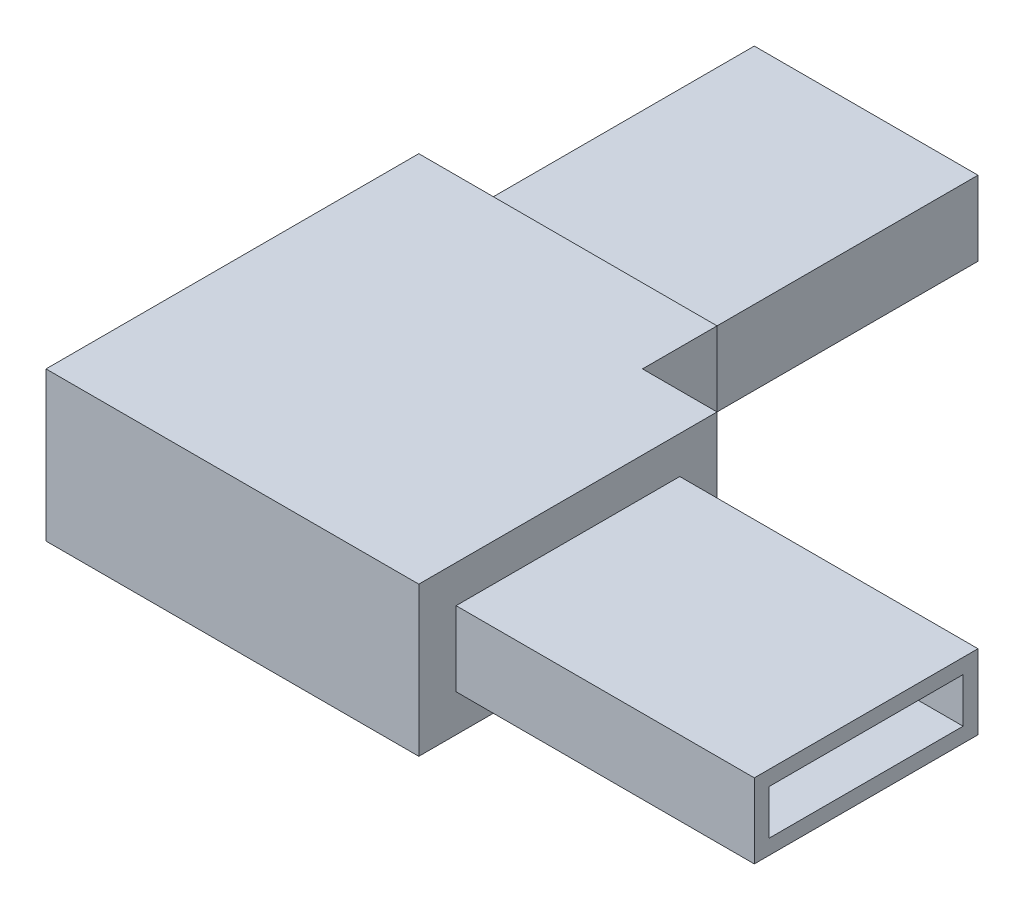
ISO-10303-21;
HEADER;
FILE_DESCRIPTION(('STEP AP214'),'2;1');
FILE_NAME('part.step','',(''),(''),'','','');
FILE_SCHEMA(('AUTOMOTIVE_DESIGN { 1 0 10303 214 1 1 1 1 }'));
ENDSEC;
DATA;
#1=APPLICATION_CONTEXT('core data for automotive mechanical design processes');
#2=APPLICATION_PROTOCOL_DEFINITION('international standard','automotive_design',2000,#1);
#3=PRODUCT_CONTEXT('',#1,'mechanical');
#4=PRODUCT('Part','Part','',(#3));
#5=PRODUCT_RELATED_PRODUCT_CATEGORY('part','',(#4));
#6=PRODUCT_DEFINITION_FORMATION('','',#4);
#7=PRODUCT_DEFINITION_CONTEXT('part definition',#1,'design');
#8=PRODUCT_DEFINITION('design','',#6,#7);
#9=PRODUCT_DEFINITION_SHAPE('','',#8);
#10=(LENGTH_UNIT() NAMED_UNIT(*) SI_UNIT(.MILLI.,.METRE.));
#11=(NAMED_UNIT(*) PLANE_ANGLE_UNIT() SI_UNIT($,.RADIAN.));
#12=(NAMED_UNIT(*) SI_UNIT($,.STERADIAN.) SOLID_ANGLE_UNIT());
#13=UNCERTAINTY_MEASURE_WITH_UNIT(LENGTH_MEASURE(1.E-05),#10,'distance_accuracy_value','');
#14=(GEOMETRIC_REPRESENTATION_CONTEXT(3) GLOBAL_UNCERTAINTY_ASSIGNED_CONTEXT((#13)) GLOBAL_UNIT_ASSIGNED_CONTEXT((#10,
#11,#12)) REPRESENTATION_CONTEXT('',''));
#15=CARTESIAN_POINT('',(0.,0.,0.));
#16=DIRECTION('',(0.,0.,1.));
#17=DIRECTION('',(1.,0.,0.));
#18=AXIS2_PLACEMENT_3D('',#15,#16,#17);
#19=CARTESIAN_POINT('',(70.,20.,-17.9567336544027));
#20=DIRECTION('',(-1.,0.,0.));
#21=DIRECTION('',(0.,0.,1.));
#22=AXIS2_PLACEMENT_3D('',#19,#20,#21);
#23=PLANE('',#22);
#24=DIRECTION('',(0.,-1.,0.));
#25=VECTOR('',#24,1.);
#26=CARTESIAN_POINT('',(70.,15.,15.));
#27=LINE('',#26,#25);
#28=CARTESIAN_POINT('',(70.,15.,15.));
#29=VERTEX_POINT('',#28);
#30=CARTESIAN_POINT('',(70.,5.,15.));
#31=VERTEX_POINT('',#30);
#32=EDGE_CURVE('E378',#29,#31,#27,.T.);
#33=ORIENTED_EDGE('',*,*,#32,.T.);
#34=DIRECTION('',(0.,0.,-1.));
#35=VECTOR('',#34,1.);
#36=CARTESIAN_POINT('',(70.,5.,15.));
#37=LINE('',#36,#35);
#38=CARTESIAN_POINT('',(70.,5.,-15.));
#39=VERTEX_POINT('',#38);
#40=EDGE_CURVE('E395',#31,#39,#37,.T.);
#41=ORIENTED_EDGE('',*,*,#40,.T.);
#42=DIRECTION('',(0.,1.,0.));
#43=VECTOR('',#42,1.);
#44=CARTESIAN_POINT('',(70.,5.,-15.));
#45=LINE('',#44,#43);
#46=CARTESIAN_POINT('',(70.,15.,-15.));
#47=VERTEX_POINT('',#46);
#48=EDGE_CURVE('E398',#39,#47,#45,.T.);
#49=ORIENTED_EDGE('',*,*,#48,.T.);
#50=DIRECTION('',(0.,0.,1.));
#51=VECTOR('',#50,1.);
#52=CARTESIAN_POINT('',(70.,15.,-15.));
#53=LINE('',#52,#51);
#54=EDGE_CURVE('E383',#47,#29,#53,.T.);
#55=ORIENTED_EDGE('',*,*,#54,.T.);
#56=EDGE_LOOP('',(#33,#41,#49,#55));
#57=FACE_BOUND('',#56,.T.);
#58=DIRECTION('',(0.,-1.,0.));
#59=VECTOR('',#58,1.);
#60=CARTESIAN_POINT('',(70.,15.,13.));
#61=LINE('',#60,#59);
#62=CARTESIAN_POINT('',(70.,13.,13.));
#63=VERTEX_POINT('',#62);
#64=CARTESIAN_POINT('',(70.,7.,13.));
#65=VERTEX_POINT('',#64);
#66=EDGE_CURVE('E232',#63,#65,#61,.T.);
#67=ORIENTED_EDGE('',*,*,#66,.F.);
#68=DIRECTION('',(0.,0.,1.));
#69=VECTOR('',#68,1.);
#70=CARTESIAN_POINT('',(70.,13.,-15.));
#71=LINE('',#70,#69);
#72=CARTESIAN_POINT('',(70.,13.,-13.));
#73=VERTEX_POINT('',#72);
#74=EDGE_CURVE('E292',#73,#63,#71,.T.);
#75=ORIENTED_EDGE('',*,*,#74,.F.);
#76=DIRECTION('',(0.,1.,0.));
#77=VECTOR('',#76,1.);
#78=CARTESIAN_POINT('',(70.,5.,-13.));
#79=LINE('',#78,#77);
#80=CARTESIAN_POINT('',(70.,7.,-13.));
#81=VERTEX_POINT('',#80);
#82=EDGE_CURVE('E49',#81,#73,#79,.T.);
#83=ORIENTED_EDGE('',*,*,#82,.F.);
#84=DIRECTION('',(0.,0.,-1.));
#85=VECTOR('',#84,1.);
#86=CARTESIAN_POINT('',(70.,7.,15.));
#87=LINE('',#86,#85);
#88=EDGE_CURVE('E323',#65,#81,#87,.T.);
#89=ORIENTED_EDGE('',*,*,#88,.F.);
#90=EDGE_LOOP('',(#67,#75,#83,#89));
#91=FACE_BOUND('',#90,.T.);
#92=ADVANCED_FACE('F33',(#57,#91),#23,.F.);
#93=CARTESIAN_POINT('',(-103.501393306404,20.,-17.9567336544027));
#94=DIRECTION('',(0.,1.,0.));
#95=DIRECTION('',(0.,0.,1.));
#96=AXIS2_PLACEMENT_3D('',#93,#94,#95);
#97=PLANE('',#96);
#98=DIRECTION('',(0.,0.,-1.));
#99=VECTOR('',#98,1.);
#100=CARTESIAN_POINT('',(20.,20.,-17.9567336544027));
#101=LINE('',#100,#99);
#102=CARTESIAN_POINT('',(20.,20.,-20.));
#103=VERTEX_POINT('',#102);
#104=CARTESIAN_POINT('',(20.,20.,-30.));
#105=VERTEX_POINT('',#104);
#106=EDGE_CURVE('E429',#103,#105,#101,.T.);
#107=ORIENTED_EDGE('',*,*,#106,.T.);
#108=DIRECTION('',(1.,0.,0.));
#109=VECTOR('',#108,1.);
#110=CARTESIAN_POINT('',(-20.,20.,-30.));
#111=LINE('',#110,#109);
#112=CARTESIAN_POINT('',(-20.,20.,-30.));
#113=VERTEX_POINT('',#112);
#114=EDGE_CURVE('E376',#113,#105,#111,.T.);
#115=ORIENTED_EDGE('',*,*,#114,.F.);
#116=DIRECTION('',(0.,0.,-1.));
#117=VECTOR('',#116,1.);
#118=CARTESIAN_POINT('',(-20.,20.,-17.9567336544027));
#119=LINE('',#118,#117);
#120=CARTESIAN_POINT('',(-20.,20.,20.));
#121=VERTEX_POINT('',#120);
#122=EDGE_CURVE('E420',#121,#113,#119,.T.);
#123=ORIENTED_EDGE('',*,*,#122,.F.);
#124=DIRECTION('',(-1.,0.,0.));
#125=VECTOR('',#124,1.);
#126=CARTESIAN_POINT('',(-103.501393306404,20.,20.));
#127=LINE('',#126,#125);
#128=CARTESIAN_POINT('',(30.,20.,20.));
#129=VERTEX_POINT('',#128);
#130=EDGE_CURVE('E423',#129,#121,#127,.T.);
#131=ORIENTED_EDGE('',*,*,#130,.F.);
#132=DIRECTION('',(0.,0.,1.));
#133=VECTOR('',#132,1.);
#134=CARTESIAN_POINT('',(30.,20.,-20.));
#135=LINE('',#134,#133);
#136=CARTESIAN_POINT('',(30.,20.,-20.));
#137=VERTEX_POINT('',#136);
#138=EDGE_CURVE('E417',#137,#129,#135,.T.);
#139=ORIENTED_EDGE('',*,*,#138,.F.);
#140=DIRECTION('',(1.,0.,0.));
#141=VECTOR('',#140,1.);
#142=CARTESIAN_POINT('',(-103.501393306404,20.,-20.));
#143=LINE('',#142,#141);
#144=EDGE_CURVE('E426',#103,#137,#143,.T.);
#145=ORIENTED_EDGE('',*,*,#144,.F.);
#146=EDGE_LOOP('',(#107,#115,#123,#131,#139,#145));
#147=FACE_BOUND('',#146,.T.);
#148=ADVANCED_FACE('F461',(#147),#97,.T.);
#149=CARTESIAN_POINT('',(-103.501393306404,0.,-17.9567336544027));
#150=DIRECTION('',(0.,1.,0.));
#151=DIRECTION('',(0.,0.,1.));
#152=AXIS2_PLACEMENT_3D('',#149,#150,#151);
#153=PLANE('',#152);
#154=DIRECTION('',(-1.,0.,0.));
#155=VECTOR('',#154,1.);
#156=CARTESIAN_POINT('',(20.,0.,-30.));
#157=LINE('',#156,#155);
#158=CARTESIAN_POINT('',(20.,0.,-30.));
#159=VERTEX_POINT('',#158);
#160=CARTESIAN_POINT('',(-20.,0.,-30.));
#161=VERTEX_POINT('',#160);
#162=EDGE_CURVE('E372',#159,#161,#157,.T.);
#163=ORIENTED_EDGE('',*,*,#162,.F.);
#164=DIRECTION('',(0.,0.,-1.));
#165=VECTOR('',#164,1.);
#166=CARTESIAN_POINT('',(20.,0.,-17.9567336544027));
#167=LINE('',#166,#165);
#168=CARTESIAN_POINT('',(20.,0.,-20.));
#169=VERTEX_POINT('',#168);
#170=EDGE_CURVE('E424',#169,#159,#167,.T.);
#171=ORIENTED_EDGE('',*,*,#170,.F.);
#172=DIRECTION('',(1.,0.,0.));
#173=VECTOR('',#172,1.);
#174=CARTESIAN_POINT('',(-103.501393306404,0.,-20.));
#175=LINE('',#174,#173);
#176=CARTESIAN_POINT('',(30.,0.,-20.));
#177=VERTEX_POINT('',#176);
#178=EDGE_CURVE('E436',#169,#177,#175,.T.);
#179=ORIENTED_EDGE('',*,*,#178,.T.);
#180=DIRECTION('',(0.,0.,-1.));
#181=VECTOR('',#180,1.);
#182=CARTESIAN_POINT('',(30.,0.,20.));
#183=LINE('',#182,#181);
#184=CARTESIAN_POINT('',(30.,0.,20.));
#185=VERTEX_POINT('',#184);
#186=EDGE_CURVE('E413',#185,#177,#183,.T.);
#187=ORIENTED_EDGE('',*,*,#186,.F.);
#188=DIRECTION('',(-1.,0.,0.));
#189=VECTOR('',#188,1.);
#190=CARTESIAN_POINT('',(-103.501393306404,0.,20.));
#191=LINE('',#190,#189);
#192=CARTESIAN_POINT('',(-20.,0.,20.));
#193=VERTEX_POINT('',#192);
#194=EDGE_CURVE('E434',#185,#193,#191,.T.);
#195=ORIENTED_EDGE('',*,*,#194,.T.);
#196=DIRECTION('',(0.,0.,-1.));
#197=VECTOR('',#196,1.);
#198=CARTESIAN_POINT('',(-20.,0.,-17.9567336544027));
#199=LINE('',#198,#197);
#200=EDGE_CURVE('E419',#193,#161,#199,.T.);
#201=ORIENTED_EDGE('',*,*,#200,.T.);
#202=EDGE_LOOP('',(#163,#171,#179,#187,#195,#201));
#203=FACE_BOUND('',#202,.T.);
#204=ADVANCED_FACE('F451',(#203),#153,.F.);
#205=CARTESIAN_POINT('',(-20.,20.,-17.9567336544027));
#206=DIRECTION('',(-1.,0.,0.));
#207=DIRECTION('',(0.,0.,1.));
#208=AXIS2_PLACEMENT_3D('',#205,#206,#207);
#209=PLANE('',#208);
#210=CARTESIAN_POINT('',(-20.,10.,-5.));
#211=DIRECTION('',(-1.,0.,0.));
#212=DIRECTION('',(0.,0.,1.));
#213=AXIS2_PLACEMENT_3D('',#210,#211,#212);
#214=CIRCLE('',#213,5.00000000000001);
#215=CARTESIAN_POINT('',(-20.,10.,0.));
#216=VERTEX_POINT('',#215);
#217=EDGE_CURVE('E253',#216,#216,#214,.T.);
#218=ORIENTED_EDGE('',*,*,#217,.F.);
#219=EDGE_LOOP('',(#218));
#220=FACE_BOUND('',#219,.T.);
#221=ORIENTED_EDGE('',*,*,#122,.T.);
#222=DIRECTION('',(0.,1.,0.));
#223=VECTOR('',#222,1.);
#224=CARTESIAN_POINT('',(-20.,0.,-30.));
#225=LINE('',#224,#223);
#226=EDGE_CURVE('E374',#161,#113,#225,.T.);
#227=ORIENTED_EDGE('',*,*,#226,.F.);
#228=ORIENTED_EDGE('',*,*,#200,.F.);
#229=DIRECTION('',(0.,-1.,0.));
#230=VECTOR('',#229,1.);
#231=CARTESIAN_POINT('',(-20.,20.,20.));
#232=LINE('',#231,#230);
#233=EDGE_CURVE('E11',#121,#193,#232,.T.);
#234=ORIENTED_EDGE('',*,*,#233,.F.);
#235=EDGE_LOOP('',(#221,#227,#228,#234));
#236=FACE_BOUND('',#235,.T.);
#237=ADVANCED_FACE('F35',(#220,#236),#209,.T.);
#238=CARTESIAN_POINT('',(20.,20.,-17.9567336544027));
#239=DIRECTION('',(-1.,0.,0.));
#240=DIRECTION('',(0.,0.,1.));
#241=AXIS2_PLACEMENT_3D('',#238,#239,#240);
#242=PLANE('',#241);
#243=DIRECTION('',(0.,-1.,0.));
#244=VECTOR('',#243,1.);
#245=CARTESIAN_POINT('',(20.,20.,-30.));
#246=LINE('',#245,#244);
#247=EDGE_CURVE('E364',#105,#159,#246,.T.);
#248=ORIENTED_EDGE('',*,*,#247,.F.);
#249=ORIENTED_EDGE('',*,*,#106,.F.);
#250=DIRECTION('',(0.,-1.,0.));
#251=VECTOR('',#250,1.);
#252=CARTESIAN_POINT('',(20.,20.,-20.));
#253=LINE('',#252,#251);
#254=EDGE_CURVE('E42',#103,#169,#253,.T.);
#255=ORIENTED_EDGE('',*,*,#254,.T.);
#256=ORIENTED_EDGE('',*,*,#170,.T.);
#257=EDGE_LOOP('',(#248,#249,#255,#256));
#258=FACE_BOUND('',#257,.T.);
#259=ADVANCED_FACE('F445',(#258),#242,.F.);
#260=CARTESIAN_POINT('',(-103.501393306404,20.,20.));
#261=DIRECTION('',(0.,0.,1.));
#262=DIRECTION('',(1.,0.,0.));
#263=AXIS2_PLACEMENT_3D('',#260,#261,#262);
#264=PLANE('',#263);
#265=ORIENTED_EDGE('',*,*,#194,.F.);
#266=DIRECTION('',(0.,-1.,0.));
#267=VECTOR('',#266,1.);
#268=CARTESIAN_POINT('',(30.,20.,20.));
#269=LINE('',#268,#267);
#270=EDGE_CURVE('E405',#129,#185,#269,.T.);
#271=ORIENTED_EDGE('',*,*,#270,.F.);
#272=ORIENTED_EDGE('',*,*,#130,.T.);
#273=ORIENTED_EDGE('',*,*,#233,.T.);
#274=EDGE_LOOP('',(#265,#271,#272,#273));
#275=FACE_BOUND('',#274,.T.);
#276=ADVANCED_FACE('F467',(#275),#264,.T.);
#277=CARTESIAN_POINT('',(-103.501393306404,20.,-20.));
#278=DIRECTION('',(0.,0.,-1.));
#279=DIRECTION('',(-1.,0.,0.));
#280=AXIS2_PLACEMENT_3D('',#277,#278,#279);
#281=PLANE('',#280);
#282=ORIENTED_EDGE('',*,*,#144,.T.);
#283=DIRECTION('',(0.,1.,0.));
#284=VECTOR('',#283,1.);
#285=CARTESIAN_POINT('',(30.,0.,-20.));
#286=LINE('',#285,#284);
#287=EDGE_CURVE('E415',#177,#137,#286,.T.);
#288=ORIENTED_EDGE('',*,*,#287,.F.);
#289=ORIENTED_EDGE('',*,*,#178,.F.);
#290=ORIENTED_EDGE('',*,*,#254,.F.);
#291=EDGE_LOOP('',(#282,#288,#289,#290));
#292=FACE_BOUND('',#291,.T.);
#293=ADVANCED_FACE('F454',(#292),#281,.T.);
#294=CARTESIAN_POINT('',(30.,0.,20.));
#295=DIRECTION('',(1.,0.,0.));
#296=DIRECTION('',(0.,0.,-1.));
#297=AXIS2_PLACEMENT_3D('',#294,#295,#296);
#298=PLANE('',#297);
#299=DIRECTION('',(0.,0.,1.));
#300=VECTOR('',#299,1.);
#301=CARTESIAN_POINT('',(30.,15.,-15.));
#302=LINE('',#301,#300);
#303=CARTESIAN_POINT('',(30.,15.,-15.));
#304=VERTEX_POINT('',#303);
#305=CARTESIAN_POINT('',(30.,15.,15.));
#306=VERTEX_POINT('',#305);
#307=EDGE_CURVE('E389',#304,#306,#302,.T.);
#308=ORIENTED_EDGE('',*,*,#307,.F.);
#309=DIRECTION('',(0.,1.,0.));
#310=VECTOR('',#309,1.);
#311=CARTESIAN_POINT('',(30.,5.,-15.));
#312=LINE('',#311,#310);
#313=CARTESIAN_POINT('',(30.,5.,-15.));
#314=VERTEX_POINT('',#313);
#315=EDGE_CURVE('E386',#314,#304,#312,.T.);
#316=ORIENTED_EDGE('',*,*,#315,.F.);
#317=DIRECTION('',(0.,0.,-1.));
#318=VECTOR('',#317,1.);
#319=CARTESIAN_POINT('',(30.,5.,15.));
#320=LINE('',#319,#318);
#321=CARTESIAN_POINT('',(30.,5.,15.));
#322=VERTEX_POINT('',#321);
#323=EDGE_CURVE('E382',#322,#314,#320,.T.);
#324=ORIENTED_EDGE('',*,*,#323,.F.);
#325=DIRECTION('',(0.,-1.,0.));
#326=VECTOR('',#325,1.);
#327=CARTESIAN_POINT('',(30.,15.,15.));
#328=LINE('',#327,#326);
#329=EDGE_CURVE('E379',#306,#322,#328,.T.);
#330=ORIENTED_EDGE('',*,*,#329,.F.);
#331=EDGE_LOOP('',(#308,#316,#324,#330));
#332=FACE_BOUND('',#331,.T.);
#333=ORIENTED_EDGE('',*,*,#270,.T.);
#334=ORIENTED_EDGE('',*,*,#186,.T.);
#335=ORIENTED_EDGE('',*,*,#287,.T.);
#336=ORIENTED_EDGE('',*,*,#138,.T.);
#337=EDGE_LOOP('',(#333,#334,#335,#336));
#338=FACE_BOUND('',#337,.T.);
#339=ADVANCED_FACE('F457',(#332,#338),#298,.T.);
#340=CARTESIAN_POINT('',(30.,15.,15.));
#341=DIRECTION('',(0.,0.,1.));
#342=DIRECTION('',(1.,0.,0.));
#343=AXIS2_PLACEMENT_3D('',#340,#341,#342);
#344=PLANE('',#343);
#345=ORIENTED_EDGE('',*,*,#32,.F.);
#346=DIRECTION('',(1.,0.,0.));
#347=VECTOR('',#346,1.);
#348=CARTESIAN_POINT('',(30.,15.,15.));
#349=LINE('',#348,#347);
#350=EDGE_CURVE('E403',#306,#29,#349,.T.);
#351=ORIENTED_EDGE('',*,*,#350,.F.);
#352=ORIENTED_EDGE('',*,*,#329,.T.);
#353=DIRECTION('',(1.,0.,0.));
#354=VECTOR('',#353,1.);
#355=CARTESIAN_POINT('',(30.,5.,15.));
#356=LINE('',#355,#354);
#357=EDGE_CURVE('E392',#322,#31,#356,.T.);
#358=ORIENTED_EDGE('',*,*,#357,.T.);
#359=EDGE_LOOP('',(#345,#351,#352,#358));
#360=FACE_BOUND('',#359,.T.);
#361=ADVANCED_FACE('F520',(#360),#344,.T.);
#362=CARTESIAN_POINT('',(30.,15.,-15.));
#363=DIRECTION('',(0.,1.,0.));
#364=DIRECTION('',(0.,0.,1.));
#365=AXIS2_PLACEMENT_3D('',#362,#363,#364);
#366=PLANE('',#365);
#367=ORIENTED_EDGE('',*,*,#54,.F.);
#368=DIRECTION('',(1.,0.,0.));
#369=VECTOR('',#368,1.);
#370=CARTESIAN_POINT('',(30.,15.,-15.));
#371=LINE('',#370,#369);
#372=EDGE_CURVE('E406',#304,#47,#371,.T.);
#373=ORIENTED_EDGE('',*,*,#372,.F.);
#374=ORIENTED_EDGE('',*,*,#307,.T.);
#375=ORIENTED_EDGE('',*,*,#350,.T.);
#376=EDGE_LOOP('',(#367,#373,#374,#375));
#377=FACE_BOUND('',#376,.T.);
#378=ADVANCED_FACE('F523',(#377),#366,.T.);
#379=CARTESIAN_POINT('',(30.,5.,-15.));
#380=DIRECTION('',(0.,0.,-1.));
#381=DIRECTION('',(-1.,0.,0.));
#382=AXIS2_PLACEMENT_3D('',#379,#380,#381);
#383=PLANE('',#382);
#384=ORIENTED_EDGE('',*,*,#48,.F.);
#385=DIRECTION('',(1.,0.,0.));
#386=VECTOR('',#385,1.);
#387=CARTESIAN_POINT('',(30.,5.,-15.));
#388=LINE('',#387,#386);
#389=EDGE_CURVE('E408',#314,#39,#388,.T.);
#390=ORIENTED_EDGE('',*,*,#389,.F.);
#391=ORIENTED_EDGE('',*,*,#315,.T.);
#392=ORIENTED_EDGE('',*,*,#372,.T.);
#393=EDGE_LOOP('',(#384,#390,#391,#392));
#394=FACE_BOUND('',#393,.T.);
#395=ADVANCED_FACE('F485',(#394),#383,.T.);
#396=CARTESIAN_POINT('',(30.,5.,15.));
#397=DIRECTION('',(0.,-1.,0.));
#398=DIRECTION('',(0.,0.,-1.));
#399=AXIS2_PLACEMENT_3D('',#396,#397,#398);
#400=PLANE('',#399);
#401=ORIENTED_EDGE('',*,*,#40,.F.);
#402=ORIENTED_EDGE('',*,*,#357,.F.);
#403=ORIENTED_EDGE('',*,*,#323,.T.);
#404=ORIENTED_EDGE('',*,*,#389,.T.);
#405=EDGE_LOOP('',(#401,#402,#403,#404));
#406=FACE_BOUND('',#405,.T.);
#407=ADVANCED_FACE('F475',(#406),#400,.T.);
#408=CARTESIAN_POINT('',(20.,0.,-30.));
#409=DIRECTION('',(0.,0.,-1.));
#410=DIRECTION('',(-1.,0.,0.));
#411=AXIS2_PLACEMENT_3D('',#408,#409,#410);
#412=PLANE('',#411);
#413=DIRECTION('',(1.,0.,0.));
#414=VECTOR('',#413,1.);
#415=CARTESIAN_POINT('',(-15.,15.,-30.));
#416=LINE('',#415,#414);
#417=CARTESIAN_POINT('',(-15.,15.,-30.));
#418=VERTEX_POINT('',#417);
#419=CARTESIAN_POINT('',(15.,15.,-30.));
#420=VERTEX_POINT('',#419);
#421=EDGE_CURVE('E348',#418,#420,#416,.T.);
#422=ORIENTED_EDGE('',*,*,#421,.F.);
#423=DIRECTION('',(0.,1.,0.));
#424=VECTOR('',#423,1.);
#425=CARTESIAN_POINT('',(-15.,5.,-30.));
#426=LINE('',#425,#424);
#427=CARTESIAN_POINT('',(-15.,5.,-30.));
#428=VERTEX_POINT('',#427);
#429=EDGE_CURVE('E345',#428,#418,#426,.T.);
#430=ORIENTED_EDGE('',*,*,#429,.F.);
#431=DIRECTION('',(-1.,0.,0.));
#432=VECTOR('',#431,1.);
#433=CARTESIAN_POINT('',(15.,5.,-30.));
#434=LINE('',#433,#432);
#435=CARTESIAN_POINT('',(15.,5.,-30.));
#436=VERTEX_POINT('',#435);
#437=EDGE_CURVE('E341',#436,#428,#434,.T.);
#438=ORIENTED_EDGE('',*,*,#437,.F.);
#439=DIRECTION('',(0.,-1.,0.));
#440=VECTOR('',#439,1.);
#441=CARTESIAN_POINT('',(15.,15.,-30.));
#442=LINE('',#441,#440);
#443=EDGE_CURVE('E338',#420,#436,#442,.T.);
#444=ORIENTED_EDGE('',*,*,#443,.F.);
#445=EDGE_LOOP('',(#422,#430,#438,#444));
#446=FACE_BOUND('',#445,.T.);
#447=ORIENTED_EDGE('',*,*,#247,.T.);
#448=ORIENTED_EDGE('',*,*,#162,.T.);
#449=ORIENTED_EDGE('',*,*,#226,.T.);
#450=ORIENTED_EDGE('',*,*,#114,.T.);
#451=EDGE_LOOP('',(#447,#448,#449,#450));
#452=FACE_BOUND('',#451,.T.);
#453=ADVANCED_FACE('F472',(#446,#452),#412,.T.);
#454=CARTESIAN_POINT('',(15.,15.,-30.));
#455=DIRECTION('',(1.,0.,0.));
#456=DIRECTION('',(0.,1.,0.));
#457=AXIS2_PLACEMENT_3D('',#454,#455,#456);
#458=PLANE('',#457);
#459=DIRECTION('',(0.,-1.,0.));
#460=VECTOR('',#459,1.);
#461=CARTESIAN_POINT('',(15.,15.,-70.));
#462=LINE('',#461,#460);
#463=CARTESIAN_POINT('',(15.,15.,-70.));
#464=VERTEX_POINT('',#463);
#465=CARTESIAN_POINT('',(15.,5.,-70.));
#466=VERTEX_POINT('',#465);
#467=EDGE_CURVE('E268',#464,#466,#462,.T.);
#468=ORIENTED_EDGE('',*,*,#467,.F.);
#469=DIRECTION('',(0.,0.,-1.));
#470=VECTOR('',#469,1.);
#471=CARTESIAN_POINT('',(15.,15.,-30.));
#472=LINE('',#471,#470);
#473=EDGE_CURVE('E362',#420,#464,#472,.T.);
#474=ORIENTED_EDGE('',*,*,#473,.F.);
#475=ORIENTED_EDGE('',*,*,#443,.T.);
#476=DIRECTION('',(0.,0.,-1.));
#477=VECTOR('',#476,1.);
#478=CARTESIAN_POINT('',(15.,5.,-30.));
#479=LINE('',#478,#477);
#480=EDGE_CURVE('E351',#436,#466,#479,.T.);
#481=ORIENTED_EDGE('',*,*,#480,.T.);
#482=EDGE_LOOP('',(#468,#474,#475,#481));
#483=FACE_BOUND('',#482,.T.);
#484=ADVANCED_FACE('F474',(#483),#458,.T.);
#485=CARTESIAN_POINT('',(-15.,15.,-30.));
#486=DIRECTION('',(0.,1.,0.));
#487=DIRECTION('',(-1.,0.,0.));
#488=AXIS2_PLACEMENT_3D('',#485,#486,#487);
#489=PLANE('',#488);
#490=DIRECTION('',(1.,0.,0.));
#491=VECTOR('',#490,1.);
#492=CARTESIAN_POINT('',(-15.,15.,-70.));
#493=LINE('',#492,#491);
#494=CARTESIAN_POINT('',(-15.,15.,-70.));
#495=VERTEX_POINT('',#494);
#496=EDGE_CURVE('E342',#495,#464,#493,.T.);
#497=ORIENTED_EDGE('',*,*,#496,.F.);
#498=DIRECTION('',(0.,0.,-1.));
#499=VECTOR('',#498,1.);
#500=CARTESIAN_POINT('',(-15.,15.,-30.));
#501=LINE('',#500,#499);
#502=EDGE_CURVE('E365',#418,#495,#501,.T.);
#503=ORIENTED_EDGE('',*,*,#502,.F.);
#504=ORIENTED_EDGE('',*,*,#421,.T.);
#505=ORIENTED_EDGE('',*,*,#473,.T.);
#506=EDGE_LOOP('',(#497,#503,#504,#505));
#507=FACE_BOUND('',#506,.T.);
#508=ADVANCED_FACE('F482',(#507),#489,.T.);
#509=CARTESIAN_POINT('',(-15.,5.,-30.));
#510=DIRECTION('',(-1.,0.,0.));
#511=DIRECTION('',(0.,0.,1.));
#512=AXIS2_PLACEMENT_3D('',#509,#510,#511);
#513=PLANE('',#512);
#514=DIRECTION('',(0.,1.,0.));
#515=VECTOR('',#514,1.);
#516=CARTESIAN_POINT('',(-15.,5.,-70.));
#517=LINE('',#516,#515);
#518=CARTESIAN_POINT('',(-15.,5.,-70.));
#519=VERTEX_POINT('',#518);
#520=EDGE_CURVE('E357',#519,#495,#517,.T.);
#521=ORIENTED_EDGE('',*,*,#520,.F.);
#522=DIRECTION('',(0.,0.,-1.));
#523=VECTOR('',#522,1.);
#524=CARTESIAN_POINT('',(-15.,5.,-30.));
#525=LINE('',#524,#523);
#526=EDGE_CURVE('E367',#428,#519,#525,.T.);
#527=ORIENTED_EDGE('',*,*,#526,.F.);
#528=ORIENTED_EDGE('',*,*,#429,.T.);
#529=ORIENTED_EDGE('',*,*,#502,.T.);
#530=EDGE_LOOP('',(#521,#527,#528,#529));
#531=FACE_BOUND('',#530,.T.);
#532=ADVANCED_FACE('F589',(#531),#513,.T.);
#533=CARTESIAN_POINT('',(15.,5.,-30.));
#534=DIRECTION('',(0.,-1.,0.));
#535=DIRECTION('',(0.,0.,-1.));
#536=AXIS2_PLACEMENT_3D('',#533,#534,#535);
#537=PLANE('',#536);
#538=DIRECTION('',(-1.,0.,0.));
#539=VECTOR('',#538,1.);
#540=CARTESIAN_POINT('',(15.,5.,-70.));
#541=LINE('',#540,#539);
#542=EDGE_CURVE('E354',#466,#519,#541,.T.);
#543=ORIENTED_EDGE('',*,*,#542,.F.);
#544=ORIENTED_EDGE('',*,*,#480,.F.);
#545=ORIENTED_EDGE('',*,*,#437,.T.);
#546=ORIENTED_EDGE('',*,*,#526,.T.);
#547=EDGE_LOOP('',(#543,#544,#545,#546));
#548=FACE_BOUND('',#547,.T.);
#549=ADVANCED_FACE('F514',(#548),#537,.T.);
#550=CARTESIAN_POINT('',(-103.501393306404,20.,-70.));
#551=DIRECTION('',(0.,0.,-1.));
#552=DIRECTION('',(-1.,0.,0.));
#553=AXIS2_PLACEMENT_3D('',#550,#551,#552);
#554=PLANE('',#553);
#555=DIRECTION('',(1.,0.,0.));
#556=VECTOR('',#555,1.);
#557=CARTESIAN_POINT('',(-103.501393306404,13.,-70.));
#558=LINE('',#557,#556);
#559=CARTESIAN_POINT('',(-13.,13.,-70.));
#560=VERTEX_POINT('',#559);
#561=CARTESIAN_POINT('',(13.,13.,-70.));
#562=VERTEX_POINT('',#561);
#563=EDGE_CURVE('E314',#560,#562,#558,.T.);
#564=ORIENTED_EDGE('',*,*,#563,.F.);
#565=DIRECTION('',(0.,1.,0.));
#566=VECTOR('',#565,1.);
#567=CARTESIAN_POINT('',(-13.,20.,-70.));
#568=LINE('',#567,#566);
#569=CARTESIAN_POINT('',(-13.,7.,-70.));
#570=VERTEX_POINT('',#569);
#571=EDGE_CURVE('E333',#570,#560,#568,.T.);
#572=ORIENTED_EDGE('',*,*,#571,.F.);
#573=DIRECTION('',(-1.,0.,0.));
#574=VECTOR('',#573,1.);
#575=CARTESIAN_POINT('',(-103.501393306404,7.,-70.));
#576=LINE('',#575,#574);
#577=CARTESIAN_POINT('',(13.,7.,-70.));
#578=VERTEX_POINT('',#577);
#579=EDGE_CURVE('E57',#578,#570,#576,.T.);
#580=ORIENTED_EDGE('',*,*,#579,.F.);
#581=DIRECTION('',(0.,-1.,0.));
#582=VECTOR('',#581,1.);
#583=CARTESIAN_POINT('',(13.,20.,-70.));
#584=LINE('',#583,#582);
#585=EDGE_CURVE('E329',#562,#578,#584,.T.);
#586=ORIENTED_EDGE('',*,*,#585,.F.);
#587=EDGE_LOOP('',(#564,#572,#580,#586));
#588=FACE_BOUND('',#587,.T.);
#589=ORIENTED_EDGE('',*,*,#496,.T.);
#590=ORIENTED_EDGE('',*,*,#467,.T.);
#591=ORIENTED_EDGE('',*,*,#542,.T.);
#592=ORIENTED_EDGE('',*,*,#520,.T.);
#593=EDGE_LOOP('',(#589,#590,#591,#592));
#594=FACE_BOUND('',#593,.T.);
#595=ADVANCED_FACE('F511',(#588,#594),#554,.T.);
#596=CARTESIAN_POINT('',(-103.501393306404,18.,-17.9567336544027));
#597=DIRECTION('',(0.,1.,0.));
#598=DIRECTION('',(0.,0.,1.));
#599=AXIS2_PLACEMENT_3D('',#596,#597,#598);
#600=PLANE('',#599);
#601=DIRECTION('',(0.,0.,-1.));
#602=VECTOR('',#601,1.);
#603=CARTESIAN_POINT('',(18.,18.,-17.9567336544027));
#604=LINE('',#603,#602);
#605=CARTESIAN_POINT('',(18.,18.,-18.));
#606=VERTEX_POINT('',#605);
#607=CARTESIAN_POINT('',(18.,18.,-28.));
#608=VERTEX_POINT('',#607);
#609=EDGE_CURVE('E226',#606,#608,#604,.T.);
#610=ORIENTED_EDGE('',*,*,#609,.F.);
#611=DIRECTION('',(1.,0.,0.));
#612=VECTOR('',#611,1.);
#613=CARTESIAN_POINT('',(-103.501393306404,18.,-18.));
#614=LINE('',#613,#612);
#615=CARTESIAN_POINT('',(28.,18.,-18.));
#616=VERTEX_POINT('',#615);
#617=EDGE_CURVE('E246',#606,#616,#614,.T.);
#618=ORIENTED_EDGE('',*,*,#617,.T.);
#619=DIRECTION('',(0.,0.,1.));
#620=VECTOR('',#619,1.);
#621=CARTESIAN_POINT('',(28.,18.,20.));
#622=LINE('',#621,#620);
#623=CARTESIAN_POINT('',(28.,18.,18.));
#624=VERTEX_POINT('',#623);
#625=EDGE_CURVE('E258',#616,#624,#622,.T.);
#626=ORIENTED_EDGE('',*,*,#625,.T.);
#627=DIRECTION('',(-1.,0.,0.));
#628=VECTOR('',#627,1.);
#629=CARTESIAN_POINT('',(-103.501393306404,18.,18.));
#630=LINE('',#629,#628);
#631=CARTESIAN_POINT('',(-18.,18.,18.));
#632=VERTEX_POINT('',#631);
#633=EDGE_CURVE('E250',#624,#632,#630,.T.);
#634=ORIENTED_EDGE('',*,*,#633,.T.);
#635=DIRECTION('',(0.,0.,-1.));
#636=VECTOR('',#635,1.);
#637=CARTESIAN_POINT('',(-18.,18.,-17.9567336544027));
#638=LINE('',#637,#636);
#639=CARTESIAN_POINT('',(-18.,18.,-28.));
#640=VERTEX_POINT('',#639);
#641=EDGE_CURVE('E229',#632,#640,#638,.T.);
#642=ORIENTED_EDGE('',*,*,#641,.T.);
#643=DIRECTION('',(1.,0.,0.));
#644=VECTOR('',#643,1.);
#645=CARTESIAN_POINT('',(20.,18.,-28.));
#646=LINE('',#645,#644);
#647=EDGE_CURVE('E221',#640,#608,#646,.T.);
#648=ORIENTED_EDGE('',*,*,#647,.T.);
#649=EDGE_LOOP('',(#610,#618,#626,#634,#642,#648));
#650=FACE_BOUND('',#649,.T.);
#651=ADVANCED_FACE('F223',(#650),#600,.F.);
#652=CARTESIAN_POINT('',(-103.501393306404,2.,-17.9567336544027));
#653=DIRECTION('',(0.,1.,0.));
#654=DIRECTION('',(0.,0.,1.));
#655=AXIS2_PLACEMENT_3D('',#652,#653,#654);
#656=PLANE('',#655);
#657=DIRECTION('',(-1.,0.,0.));
#658=VECTOR('',#657,1.);
#659=CARTESIAN_POINT('',(-103.501393306404,2.,-28.));
#660=LINE('',#659,#658);
#661=CARTESIAN_POINT('',(18.,2.,-28.));
#662=VERTEX_POINT('',#661);
#663=CARTESIAN_POINT('',(-18.,2.,-28.));
#664=VERTEX_POINT('',#663);
#665=EDGE_CURVE('E238',#662,#664,#660,.T.);
#666=ORIENTED_EDGE('',*,*,#665,.T.);
#667=DIRECTION('',(0.,0.,-1.));
#668=VECTOR('',#667,1.);
#669=CARTESIAN_POINT('',(-18.,2.,-17.9567336544027));
#670=LINE('',#669,#668);
#671=CARTESIAN_POINT('',(-18.,2.,18.));
#672=VERTEX_POINT('',#671);
#673=EDGE_CURVE('E259',#672,#664,#670,.T.);
#674=ORIENTED_EDGE('',*,*,#673,.F.);
#675=DIRECTION('',(-1.,0.,0.));
#676=VECTOR('',#675,1.);
#677=CARTESIAN_POINT('',(-103.501393306404,2.,18.));
#678=LINE('',#677,#676);
#679=CARTESIAN_POINT('',(28.,2.,18.));
#680=VERTEX_POINT('',#679);
#681=EDGE_CURVE('E265',#680,#672,#678,.T.);
#682=ORIENTED_EDGE('',*,*,#681,.F.);
#683=DIRECTION('',(0.,0.,-1.));
#684=VECTOR('',#683,1.);
#685=CARTESIAN_POINT('',(28.,2.,-17.9567336544027));
#686=LINE('',#685,#684);
#687=CARTESIAN_POINT('',(28.,2.,-18.));
#688=VERTEX_POINT('',#687);
#689=EDGE_CURVE('E274',#680,#688,#686,.T.);
#690=ORIENTED_EDGE('',*,*,#689,.T.);
#691=DIRECTION('',(1.,0.,0.));
#692=VECTOR('',#691,1.);
#693=CARTESIAN_POINT('',(-103.501393306404,2.,-18.));
#694=LINE('',#693,#692);
#695=CARTESIAN_POINT('',(18.,2.,-18.));
#696=VERTEX_POINT('',#695);
#697=EDGE_CURVE('E271',#696,#688,#694,.T.);
#698=ORIENTED_EDGE('',*,*,#697,.F.);
#699=DIRECTION('',(0.,0.,-1.));
#700=VECTOR('',#699,1.);
#701=CARTESIAN_POINT('',(18.,2.,-17.9567336544027));
#702=LINE('',#701,#700);
#703=EDGE_CURVE('E256',#696,#662,#702,.T.);
#704=ORIENTED_EDGE('',*,*,#703,.T.);
#705=EDGE_LOOP('',(#666,#674,#682,#690,#698,#704));
#706=FACE_BOUND('',#705,.T.);
#707=ADVANCED_FACE('F627',(#706),#656,.T.);
#708=CARTESIAN_POINT('',(-18.,20.,-17.9567336544027));
#709=DIRECTION('',(-1.,0.,0.));
#710=DIRECTION('',(0.,0.,1.));
#711=AXIS2_PLACEMENT_3D('',#708,#709,#710);
#712=PLANE('',#711);
#713=CARTESIAN_POINT('',(-18.,10.,-5.));
#714=DIRECTION('',(-1.,0.,0.));
#715=DIRECTION('',(0.,0.,1.));
#716=AXIS2_PLACEMENT_3D('',#713,#714,#715);
#717=CIRCLE('',#716,5.00000000000001);
#718=CARTESIAN_POINT('',(-18.,10.,0.));
#719=VERTEX_POINT('',#718);
#720=EDGE_CURVE('E37',#719,#719,#717,.T.);
#721=ORIENTED_EDGE('',*,*,#720,.T.);
#722=EDGE_LOOP('',(#721));
#723=FACE_BOUND('',#722,.T.);
#724=ORIENTED_EDGE('',*,*,#641,.F.);
#725=DIRECTION('',(0.,-1.,0.));
#726=VECTOR('',#725,1.);
#727=CARTESIAN_POINT('',(-18.,20.,18.));
#728=LINE('',#727,#726);
#729=EDGE_CURVE('E248',#632,#672,#728,.T.);
#730=ORIENTED_EDGE('',*,*,#729,.T.);
#731=ORIENTED_EDGE('',*,*,#673,.T.);
#732=DIRECTION('',(0.,1.,0.));
#733=VECTOR('',#732,1.);
#734=CARTESIAN_POINT('',(-18.,0.,-28.));
#735=LINE('',#734,#733);
#736=EDGE_CURVE('E233',#664,#640,#735,.T.);
#737=ORIENTED_EDGE('',*,*,#736,.T.);
#738=EDGE_LOOP('',(#724,#730,#731,#737));
#739=FACE_BOUND('',#738,.T.);
#740=ADVANCED_FACE('F638',(#723,#739),#712,.F.);
#741=CARTESIAN_POINT('',(18.,20.,-17.9567336544027));
#742=DIRECTION('',(-1.,0.,0.));
#743=DIRECTION('',(0.,0.,1.));
#744=AXIS2_PLACEMENT_3D('',#741,#742,#743);
#745=PLANE('',#744);
#746=DIRECTION('',(0.,-1.,0.));
#747=VECTOR('',#746,1.);
#748=CARTESIAN_POINT('',(18.,20.,-28.));
#749=LINE('',#748,#747);
#750=EDGE_CURVE('E236',#608,#662,#749,.T.);
#751=ORIENTED_EDGE('',*,*,#750,.T.);
#752=ORIENTED_EDGE('',*,*,#703,.F.);
#753=DIRECTION('',(0.,-1.,0.));
#754=VECTOR('',#753,1.);
#755=CARTESIAN_POINT('',(18.,20.,-18.));
#756=LINE('',#755,#754);
#757=EDGE_CURVE('E245',#606,#696,#756,.T.);
#758=ORIENTED_EDGE('',*,*,#757,.F.);
#759=ORIENTED_EDGE('',*,*,#609,.T.);
#760=EDGE_LOOP('',(#751,#752,#758,#759));
#761=FACE_BOUND('',#760,.T.);
#762=ADVANCED_FACE('F244',(#761),#745,.T.);
#763=CARTESIAN_POINT('',(-103.501393306404,20.,18.));
#764=DIRECTION('',(0.,0.,1.));
#765=DIRECTION('',(1.,0.,0.));
#766=AXIS2_PLACEMENT_3D('',#763,#764,#765);
#767=PLANE('',#766);
#768=ORIENTED_EDGE('',*,*,#681,.T.);
#769=ORIENTED_EDGE('',*,*,#729,.F.);
#770=ORIENTED_EDGE('',*,*,#633,.F.);
#771=DIRECTION('',(0.,-1.,0.));
#772=VECTOR('',#771,1.);
#773=CARTESIAN_POINT('',(28.,0.,18.));
#774=LINE('',#773,#772);
#775=EDGE_CURVE('E276',#624,#680,#774,.T.);
#776=ORIENTED_EDGE('',*,*,#775,.T.);
#777=EDGE_LOOP('',(#768,#769,#770,#776));
#778=FACE_BOUND('',#777,.T.);
#779=ADVANCED_FACE('F651',(#778),#767,.F.);
#780=CARTESIAN_POINT('',(-103.501393306404,20.,-18.));
#781=DIRECTION('',(0.,0.,-1.));
#782=DIRECTION('',(-1.,0.,0.));
#783=AXIS2_PLACEMENT_3D('',#780,#781,#782);
#784=PLANE('',#783);
#785=ORIENTED_EDGE('',*,*,#617,.F.);
#786=ORIENTED_EDGE('',*,*,#757,.T.);
#787=ORIENTED_EDGE('',*,*,#697,.T.);
#788=DIRECTION('',(0.,1.,0.));
#789=VECTOR('',#788,1.);
#790=CARTESIAN_POINT('',(28.,0.,-18.));
#791=LINE('',#790,#789);
#792=EDGE_CURVE('E260',#688,#616,#791,.T.);
#793=ORIENTED_EDGE('',*,*,#792,.T.);
#794=EDGE_LOOP('',(#785,#786,#787,#793));
#795=FACE_BOUND('',#794,.T.);
#796=ADVANCED_FACE('F662',(#795),#784,.F.);
#797=CARTESIAN_POINT('',(28.,0.,20.));
#798=DIRECTION('',(1.,0.,0.));
#799=DIRECTION('',(0.,0.,-1.));
#800=AXIS2_PLACEMENT_3D('',#797,#798,#799);
#801=PLANE('',#800);
#802=DIRECTION('',(0.,0.,1.));
#803=VECTOR('',#802,1.);
#804=CARTESIAN_POINT('',(28.,13.,20.));
#805=LINE('',#804,#803);
#806=CARTESIAN_POINT('',(28.,13.,-13.));
#807=VERTEX_POINT('',#806);
#808=CARTESIAN_POINT('',(28.,13.,13.));
#809=VERTEX_POINT('',#808);
#810=EDGE_CURVE('E279',#807,#809,#805,.T.);
#811=ORIENTED_EDGE('',*,*,#810,.T.);
#812=DIRECTION('',(0.,-1.,0.));
#813=VECTOR('',#812,1.);
#814=CARTESIAN_POINT('',(28.,0.,13.));
#815=LINE('',#814,#813);
#816=CARTESIAN_POINT('',(28.,7.,13.));
#817=VERTEX_POINT('',#816);
#818=EDGE_CURVE('E289',#809,#817,#815,.T.);
#819=ORIENTED_EDGE('',*,*,#818,.T.);
#820=DIRECTION('',(0.,0.,-1.));
#821=VECTOR('',#820,1.);
#822=CARTESIAN_POINT('',(28.,7.,20.));
#823=LINE('',#822,#821);
#824=CARTESIAN_POINT('',(28.,7.,-13.));
#825=VERTEX_POINT('',#824);
#826=EDGE_CURVE('E286',#817,#825,#823,.T.);
#827=ORIENTED_EDGE('',*,*,#826,.T.);
#828=DIRECTION('',(0.,1.,0.));
#829=VECTOR('',#828,1.);
#830=CARTESIAN_POINT('',(28.,0.,-13.));
#831=LINE('',#830,#829);
#832=EDGE_CURVE('E283',#825,#807,#831,.T.);
#833=ORIENTED_EDGE('',*,*,#832,.T.);
#834=EDGE_LOOP('',(#811,#819,#827,#833));
#835=FACE_BOUND('',#834,.T.);
#836=ORIENTED_EDGE('',*,*,#775,.F.);
#837=ORIENTED_EDGE('',*,*,#625,.F.);
#838=ORIENTED_EDGE('',*,*,#792,.F.);
#839=ORIENTED_EDGE('',*,*,#689,.F.);
#840=EDGE_LOOP('',(#836,#837,#838,#839));
#841=FACE_BOUND('',#840,.T.);
#842=ADVANCED_FACE('F672',(#835,#841),#801,.F.);
#843=CARTESIAN_POINT('',(30.,15.,13.));
#844=DIRECTION('',(0.,0.,1.));
#845=DIRECTION('',(1.,0.,0.));
#846=AXIS2_PLACEMENT_3D('',#843,#844,#845);
#847=PLANE('',#846);
#848=ORIENTED_EDGE('',*,*,#66,.T.);
#849=DIRECTION('',(1.,0.,0.));
#850=VECTOR('',#849,1.);
#851=CARTESIAN_POINT('',(30.,7.,13.));
#852=LINE('',#851,#850);
#853=EDGE_CURVE('E282',#817,#65,#852,.T.);
#854=ORIENTED_EDGE('',*,*,#853,.F.);
#855=ORIENTED_EDGE('',*,*,#818,.F.);
#856=DIRECTION('',(1.,0.,0.));
#857=VECTOR('',#856,1.);
#858=CARTESIAN_POINT('',(30.,13.,13.));
#859=LINE('',#858,#857);
#860=EDGE_CURVE('E294',#809,#63,#859,.T.);
#861=ORIENTED_EDGE('',*,*,#860,.T.);
#862=EDGE_LOOP('',(#848,#854,#855,#861));
#863=FACE_BOUND('',#862,.T.);
#864=ADVANCED_FACE('F682',(#863),#847,.F.);
#865=CARTESIAN_POINT('',(30.,13.,-15.));
#866=DIRECTION('',(0.,1.,0.));
#867=DIRECTION('',(0.,0.,1.));
#868=AXIS2_PLACEMENT_3D('',#865,#866,#867);
#869=PLANE('',#868);
#870=ORIENTED_EDGE('',*,*,#74,.T.);
#871=ORIENTED_EDGE('',*,*,#860,.F.);
#872=ORIENTED_EDGE('',*,*,#810,.F.);
#873=DIRECTION('',(1.,0.,0.));
#874=VECTOR('',#873,1.);
#875=CARTESIAN_POINT('',(30.,13.,-13.));
#876=LINE('',#875,#874);
#877=EDGE_CURVE('E296',#807,#73,#876,.T.);
#878=ORIENTED_EDGE('',*,*,#877,.T.);
#879=EDGE_LOOP('',(#870,#871,#872,#878));
#880=FACE_BOUND('',#879,.T.);
#881=ADVANCED_FACE('F692',(#880),#869,.F.);
#882=CARTESIAN_POINT('',(30.,5.,-13.));
#883=DIRECTION('',(0.,0.,-1.));
#884=DIRECTION('',(-1.,0.,0.));
#885=AXIS2_PLACEMENT_3D('',#882,#883,#884);
#886=PLANE('',#885);
#887=ORIENTED_EDGE('',*,*,#82,.T.);
#888=ORIENTED_EDGE('',*,*,#877,.F.);
#889=ORIENTED_EDGE('',*,*,#832,.F.);
#890=DIRECTION('',(1.,0.,0.));
#891=VECTOR('',#890,1.);
#892=CARTESIAN_POINT('',(30.,7.,-13.));
#893=LINE('',#892,#891);
#894=EDGE_CURVE('E298',#825,#81,#893,.T.);
#895=ORIENTED_EDGE('',*,*,#894,.T.);
#896=EDGE_LOOP('',(#887,#888,#889,#895));
#897=FACE_BOUND('',#896,.T.);
#898=ADVANCED_FACE('F702',(#897),#886,.F.);
#899=CARTESIAN_POINT('',(30.,7.,15.));
#900=DIRECTION('',(0.,-1.,0.));
#901=DIRECTION('',(0.,0.,-1.));
#902=AXIS2_PLACEMENT_3D('',#899,#900,#901);
#903=PLANE('',#902);
#904=ORIENTED_EDGE('',*,*,#88,.T.);
#905=ORIENTED_EDGE('',*,*,#894,.F.);
#906=ORIENTED_EDGE('',*,*,#826,.F.);
#907=ORIENTED_EDGE('',*,*,#853,.T.);
#908=EDGE_LOOP('',(#904,#905,#906,#907));
#909=FACE_BOUND('',#908,.T.);
#910=ADVANCED_FACE('F712',(#909),#903,.F.);
#911=CARTESIAN_POINT('',(20.,0.,-28.));
#912=DIRECTION('',(0.,0.,-1.));
#913=DIRECTION('',(-1.,0.,0.));
#914=AXIS2_PLACEMENT_3D('',#911,#912,#913);
#915=PLANE('',#914);
#916=DIRECTION('',(1.,0.,0.));
#917=VECTOR('',#916,1.);
#918=CARTESIAN_POINT('',(20.,13.,-28.));
#919=LINE('',#918,#917);
#920=CARTESIAN_POINT('',(-13.,13.,-28.));
#921=VERTEX_POINT('',#920);
#922=CARTESIAN_POINT('',(13.,13.,-28.));
#923=VERTEX_POINT('',#922);
#924=EDGE_CURVE('E301',#921,#923,#919,.T.);
#925=ORIENTED_EDGE('',*,*,#924,.T.);
#926=DIRECTION('',(0.,-1.,0.));
#927=VECTOR('',#926,1.);
#928=CARTESIAN_POINT('',(13.,0.,-28.));
#929=LINE('',#928,#927);
#930=CARTESIAN_POINT('',(13.,7.,-28.));
#931=VERTEX_POINT('',#930);
#932=EDGE_CURVE('E311',#923,#931,#929,.T.);
#933=ORIENTED_EDGE('',*,*,#932,.T.);
#934=DIRECTION('',(-1.,0.,0.));
#935=VECTOR('',#934,1.);
#936=CARTESIAN_POINT('',(20.,7.,-28.));
#937=LINE('',#936,#935);
#938=CARTESIAN_POINT('',(-13.,7.,-28.));
#939=VERTEX_POINT('',#938);
#940=EDGE_CURVE('E308',#931,#939,#937,.T.);
#941=ORIENTED_EDGE('',*,*,#940,.T.);
#942=DIRECTION('',(0.,1.,0.));
#943=VECTOR('',#942,1.);
#944=CARTESIAN_POINT('',(-13.,0.,-28.));
#945=LINE('',#944,#943);
#946=EDGE_CURVE('E305',#939,#921,#945,.T.);
#947=ORIENTED_EDGE('',*,*,#946,.T.);
#948=EDGE_LOOP('',(#925,#933,#941,#947));
#949=FACE_BOUND('',#948,.T.);
#950=ORIENTED_EDGE('',*,*,#750,.F.);
#951=ORIENTED_EDGE('',*,*,#647,.F.);
#952=ORIENTED_EDGE('',*,*,#736,.F.);
#953=ORIENTED_EDGE('',*,*,#665,.F.);
#954=EDGE_LOOP('',(#950,#951,#952,#953));
#955=FACE_BOUND('',#954,.T.);
#956=ADVANCED_FACE('F237',(#949,#955),#915,.F.);
#957=CARTESIAN_POINT('',(13.,15.,-30.));
#958=DIRECTION('',(1.,0.,0.));
#959=DIRECTION('',(0.,1.,0.));
#960=AXIS2_PLACEMENT_3D('',#957,#958,#959);
#961=PLANE('',#960);
#962=ORIENTED_EDGE('',*,*,#585,.T.);
#963=DIRECTION('',(0.,0.,-1.));
#964=VECTOR('',#963,1.);
#965=CARTESIAN_POINT('',(13.,7.,-30.));
#966=LINE('',#965,#964);
#967=EDGE_CURVE('E304',#931,#578,#966,.T.);
#968=ORIENTED_EDGE('',*,*,#967,.F.);
#969=ORIENTED_EDGE('',*,*,#932,.F.);
#970=DIRECTION('',(0.,0.,-1.));
#971=VECTOR('',#970,1.);
#972=CARTESIAN_POINT('',(13.,13.,-30.));
#973=LINE('',#972,#971);
#974=EDGE_CURVE('E242',#923,#562,#973,.T.);
#975=ORIENTED_EDGE('',*,*,#974,.T.);
#976=EDGE_LOOP('',(#962,#968,#969,#975));
#977=FACE_BOUND('',#976,.T.);
#978=ADVANCED_FACE('F730',(#977),#961,.F.);
#979=CARTESIAN_POINT('',(-15.,13.,-30.));
#980=DIRECTION('',(0.,1.,0.));
#981=DIRECTION('',(-1.,0.,0.));
#982=AXIS2_PLACEMENT_3D('',#979,#980,#981);
#983=PLANE('',#982);
#984=ORIENTED_EDGE('',*,*,#563,.T.);
#985=ORIENTED_EDGE('',*,*,#974,.F.);
#986=ORIENTED_EDGE('',*,*,#924,.F.);
#987=DIRECTION('',(0.,0.,-1.));
#988=VECTOR('',#987,1.);
#989=CARTESIAN_POINT('',(-13.,13.,-30.));
#990=LINE('',#989,#988);
#991=EDGE_CURVE('E316',#921,#560,#990,.T.);
#992=ORIENTED_EDGE('',*,*,#991,.T.);
#993=EDGE_LOOP('',(#984,#985,#986,#992));
#994=FACE_BOUND('',#993,.T.);
#995=ADVANCED_FACE('F740',(#994),#983,.F.);
#996=CARTESIAN_POINT('',(-13.,5.,-30.));
#997=DIRECTION('',(-1.,0.,0.));
#998=DIRECTION('',(0.,0.,1.));
#999=AXIS2_PLACEMENT_3D('',#996,#997,#998);
#1000=PLANE('',#999);
#1001=ORIENTED_EDGE('',*,*,#571,.T.);
#1002=ORIENTED_EDGE('',*,*,#991,.F.);
#1003=ORIENTED_EDGE('',*,*,#946,.F.);
#1004=DIRECTION('',(0.,0.,-1.));
#1005=VECTOR('',#1004,1.);
#1006=CARTESIAN_POINT('',(-13.,7.,-30.));
#1007=LINE('',#1006,#1005);
#1008=EDGE_CURVE('E318',#939,#570,#1007,.T.);
#1009=ORIENTED_EDGE('',*,*,#1008,.T.);
#1010=EDGE_LOOP('',(#1001,#1002,#1003,#1009));
#1011=FACE_BOUND('',#1010,.T.);
#1012=ADVANCED_FACE('F750',(#1011),#1000,.F.);
#1013=CARTESIAN_POINT('',(15.,7.,-30.));
#1014=DIRECTION('',(0.,-1.,0.));
#1015=DIRECTION('',(0.,0.,-1.));
#1016=AXIS2_PLACEMENT_3D('',#1013,#1014,#1015);
#1017=PLANE('',#1016);
#1018=ORIENTED_EDGE('',*,*,#579,.T.);
#1019=ORIENTED_EDGE('',*,*,#1008,.F.);
#1020=ORIENTED_EDGE('',*,*,#940,.F.);
#1021=ORIENTED_EDGE('',*,*,#967,.T.);
#1022=EDGE_LOOP('',(#1018,#1019,#1020,#1021));
#1023=FACE_BOUND('',#1022,.T.);
#1024=ADVANCED_FACE('F760',(#1023),#1017,.F.);
#1025=CARTESIAN_POINT('',(-10.,10.,-5.));
#1026=DIRECTION('',(-1.,0.,0.));
#1027=DIRECTION('',(0.,0.,1.));
#1028=AXIS2_PLACEMENT_3D('',#1025,#1026,#1027);
#1029=CYLINDRICAL_SURFACE('',#1028,5.00000000000001);
#1030=ORIENTED_EDGE('',*,*,#217,.T.);
#1031=EDGE_LOOP('',(#1030));
#1032=FACE_BOUND('',#1031,.T.);
#1033=ORIENTED_EDGE('',*,*,#720,.F.);
#1034=EDGE_LOOP('',(#1033));
#1035=FACE_BOUND('',#1034,.T.);
#1036=ADVANCED_FACE('F769',(#1032,#1035),#1029,.F.);
#1037=CLOSED_SHELL('',(#92,#148,#204,#237,#259,#276,#293,#339,#361,#378,#395,#407,#453,#484,
#508,#532,#549,#595,#651,#707,#740,#762,#779,#796,#842,#864,#881,#898,#910,#956,#978,#995,#1012,
#1024,#1036));
#1038=MANIFOLD_SOLID_BREP('B2',#1037);
#1039=ADVANCED_BREP_SHAPE_REPRESENTATION('',(#18,#1038),#14);
#1040=SHAPE_DEFINITION_REPRESENTATION(#9,#1039);
ENDSEC;
END-ISO-10303-21;
